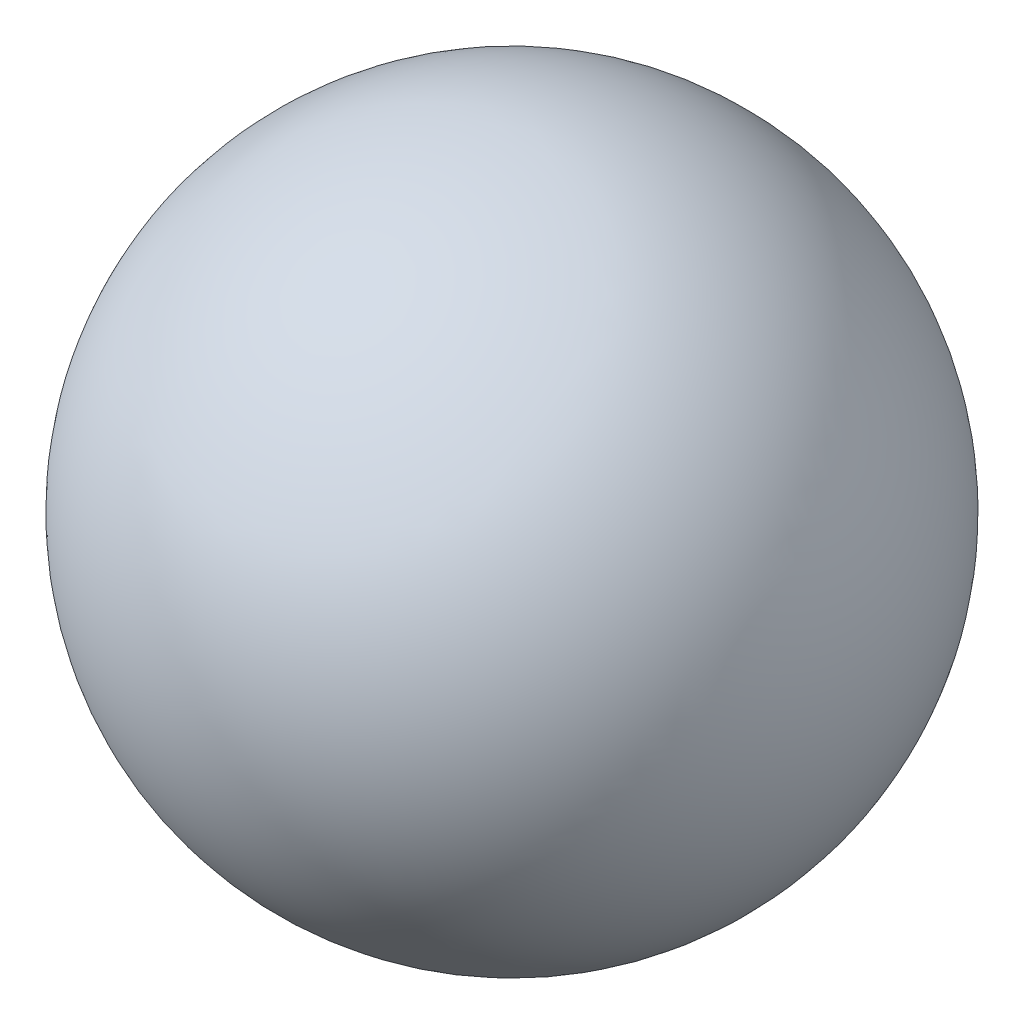
ISO-10303-21;
HEADER;
FILE_DESCRIPTION(('STEP AP214'),'2;1');
FILE_NAME('part.step','',(''),(''),'','','');
FILE_SCHEMA(('AUTOMOTIVE_DESIGN { 1 0 10303 214 1 1 1 1 }'));
ENDSEC;
DATA;
#1=APPLICATION_CONTEXT('core data for automotive mechanical design processes');
#2=APPLICATION_PROTOCOL_DEFINITION('international standard','automotive_design',2000,#1);
#3=PRODUCT_CONTEXT('',#1,'mechanical');
#4=PRODUCT('Part','Part','',(#3));
#5=PRODUCT_RELATED_PRODUCT_CATEGORY('part','',(#4));
#6=PRODUCT_DEFINITION_FORMATION('','',#4);
#7=PRODUCT_DEFINITION_CONTEXT('part definition',#1,'design');
#8=PRODUCT_DEFINITION('design','',#6,#7);
#9=PRODUCT_DEFINITION_SHAPE('','',#8);
#10=(LENGTH_UNIT() NAMED_UNIT(*) SI_UNIT(.MILLI.,.METRE.));
#11=(NAMED_UNIT(*) PLANE_ANGLE_UNIT() SI_UNIT($,.RADIAN.));
#12=(NAMED_UNIT(*) SI_UNIT($,.STERADIAN.) SOLID_ANGLE_UNIT());
#13=UNCERTAINTY_MEASURE_WITH_UNIT(LENGTH_MEASURE(1.E-05),#10,'distance_accuracy_value','');
#14=(GEOMETRIC_REPRESENTATION_CONTEXT(3) GLOBAL_UNCERTAINTY_ASSIGNED_CONTEXT((#13)) GLOBAL_UNIT_ASSIGNED_CONTEXT((#10,
#11,#12)) REPRESENTATION_CONTEXT('',''));
#15=CARTESIAN_POINT('',(0.,0.,0.));
#16=DIRECTION('',(0.,0.,1.));
#17=DIRECTION('',(1.,0.,0.));
#18=AXIS2_PLACEMENT_3D('',#15,#16,#17);
#19=CARTESIAN_POINT('',(14.,58.75,0.));
#20=DIRECTION('',(-1.,0.,0.));
#21=DIRECTION('',(0.,-1.,0.));
#22=AXIS2_PLACEMENT_3D('',#19,#20,#21);
#23=SPHERICAL_SURFACE('',#22,10.5);
#24=CARTESIAN_POINT('',(3.5,58.75,0.));
#25=VERTEX_POINT('',#24);
#26=VERTEX_LOOP('',#25);
#27=FACE_BOUND('',#26,.T.);
#28=ADVANCED_FACE('F29',(#27),#23,.T.);
#29=CLOSED_SHELL('',(#28));
#30=MANIFOLD_SOLID_BREP('B2',#29);
#31=ADVANCED_BREP_SHAPE_REPRESENTATION('',(#18,#30),#14);
#32=SHAPE_DEFINITION_REPRESENTATION(#9,#31);
ENDSEC;
END-ISO-10303-21;
